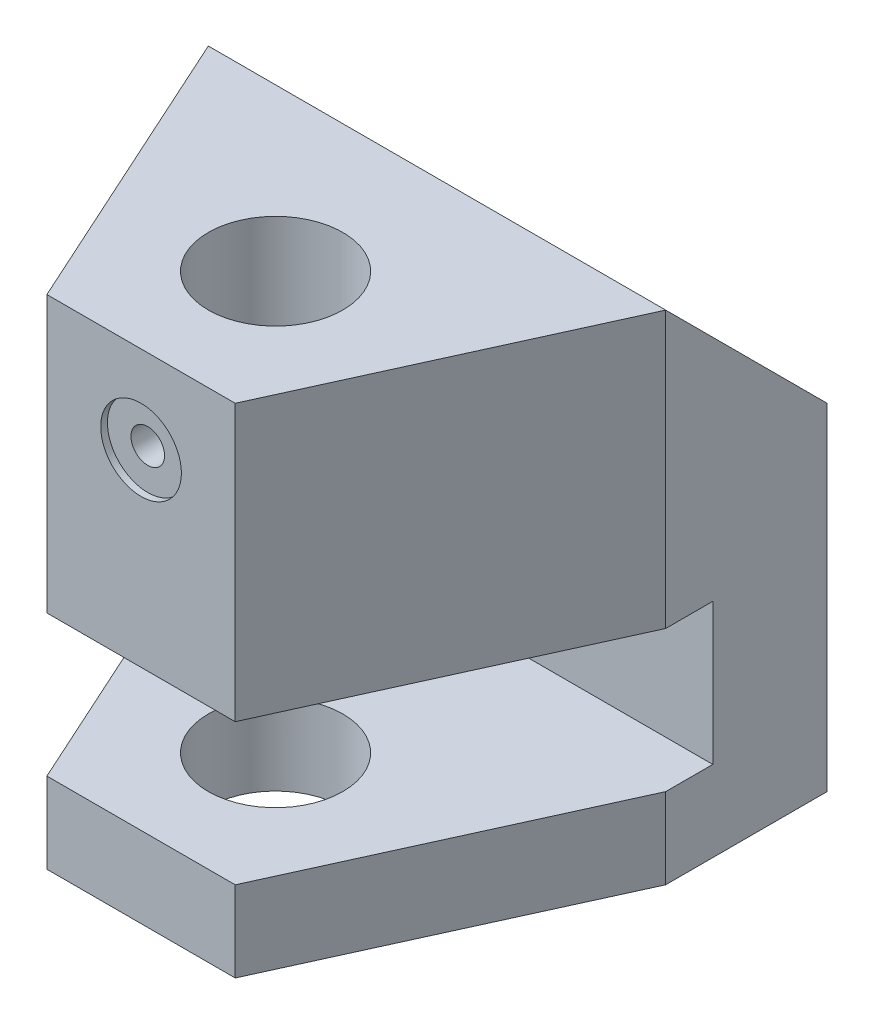
ISO-10303-21;
HEADER;
FILE_DESCRIPTION(('STEP AP214'),'2;1');
FILE_NAME('part.step','',(''),(''),'','','');
FILE_SCHEMA(('AUTOMOTIVE_DESIGN { 1 0 10303 214 1 1 1 1 }'));
ENDSEC;
DATA;
#1=APPLICATION_CONTEXT('core data for automotive mechanical design processes');
#2=APPLICATION_PROTOCOL_DEFINITION('international standard','automotive_design',2000,#1);
#3=PRODUCT_CONTEXT('',#1,'mechanical');
#4=PRODUCT('Part','Part','',(#3));
#5=PRODUCT_RELATED_PRODUCT_CATEGORY('part','',(#4));
#6=PRODUCT_DEFINITION_FORMATION('','',#4);
#7=PRODUCT_DEFINITION_CONTEXT('part definition',#1,'design');
#8=PRODUCT_DEFINITION('design','',#6,#7);
#9=PRODUCT_DEFINITION_SHAPE('','',#8);
#10=(LENGTH_UNIT() NAMED_UNIT(*) SI_UNIT(.MILLI.,.METRE.));
#11=(NAMED_UNIT(*) PLANE_ANGLE_UNIT() SI_UNIT($,.RADIAN.));
#12=(NAMED_UNIT(*) SI_UNIT($,.STERADIAN.) SOLID_ANGLE_UNIT());
#13=UNCERTAINTY_MEASURE_WITH_UNIT(LENGTH_MEASURE(1.E-05),#10,'distance_accuracy_value','');
#14=(GEOMETRIC_REPRESENTATION_CONTEXT(3) GLOBAL_UNCERTAINTY_ASSIGNED_CONTEXT((#13)) GLOBAL_UNIT_ASSIGNED_CONTEXT((#10,
#11,#12)) REPRESENTATION_CONTEXT('',''));
#15=CARTESIAN_POINT('',(0.,0.,0.));
#16=DIRECTION('',(0.,0.,1.));
#17=DIRECTION('',(1.,0.,0.));
#18=AXIS2_PLACEMENT_3D('',#15,#16,#17);
#19=CARTESIAN_POINT('',(0.,0.,34.));
#20=DIRECTION('',(0.,0.,-1.));
#21=DIRECTION('',(-1.,0.,0.));
#22=AXIS2_PLACEMENT_3D('',#19,#20,#21);
#23=PLANE('',#22);
#24=CARTESIAN_POINT('',(34.,61.,34.));
#25=DIRECTION('',(0.,0.,1.));
#26=DIRECTION('',(1.,0.,0.));
#27=AXIS2_PLACEMENT_3D('',#24,#25,#26);
#28=CIRCLE('',#27,6.00000000000001);
#29=CARTESIAN_POINT('',(40.,61.,34.));
#30=VERTEX_POINT('',#29);
#31=EDGE_CURVE('E436',#30,#30,#28,.T.);
#32=ORIENTED_EDGE('',*,*,#31,.F.);
#33=EDGE_LOOP('',(#32));
#34=FACE_BOUND('',#33,.T.);
#35=DIRECTION('',(-1.,0.,0.));
#36=VECTOR('',#35,1.);
#37=CARTESIAN_POINT('',(0.,74.,34.));
#38=LINE('',#37,#36);
#39=CARTESIAN_POINT('',(48.,74.,34.));
#40=VERTEX_POINT('',#39);
#41=CARTESIAN_POINT('',(20.,74.,34.));
#42=VERTEX_POINT('',#41);
#43=EDGE_CURVE('E165',#40,#42,#38,.T.);
#44=ORIENTED_EDGE('',*,*,#43,.T.);
#45=DIRECTION('',(0.,-1.,0.));
#46=VECTOR('',#45,1.);
#47=CARTESIAN_POINT('',(20.,0.,34.));
#48=LINE('',#47,#46);
#49=CARTESIAN_POINT('',(20.,33.,34.));
#50=VERTEX_POINT('',#49);
#51=EDGE_CURVE('E210',#42,#50,#48,.T.);
#52=ORIENTED_EDGE('',*,*,#51,.T.);
#53=DIRECTION('',(1.,0.,0.));
#54=VECTOR('',#53,1.);
#55=CARTESIAN_POINT('',(0.,33.,34.));
#56=LINE('',#55,#54);
#57=CARTESIAN_POINT('',(48.,33.,34.));
#58=VERTEX_POINT('',#57);
#59=EDGE_CURVE('E158',#50,#58,#56,.T.);
#60=ORIENTED_EDGE('',*,*,#59,.T.);
#61=DIRECTION('',(0.,1.,0.));
#62=VECTOR('',#61,1.);
#63=CARTESIAN_POINT('',(48.,0.,34.));
#64=LINE('',#63,#62);
#65=EDGE_CURVE('E191',#58,#40,#64,.T.);
#66=ORIENTED_EDGE('',*,*,#65,.T.);
#67=EDGE_LOOP('',(#44,#52,#60,#66));
#68=FACE_BOUND('',#67,.T.);
#69=ADVANCED_FACE('F33',(#34,#68),#23,.F.);
#70=CARTESIAN_POINT('',(0.,0.,34.));
#71=DIRECTION('',(1.,0.,0.));
#72=DIRECTION('',(0.,0.,-1.));
#73=AXIS2_PLACEMENT_3D('',#70,#71,#72);
#74=PLANE('',#73);
#75=DIRECTION('',(0.,1.,0.));
#76=VECTOR('',#75,1.);
#77=CARTESIAN_POINT('',(0.,0.,-10.0000000000003));
#78=LINE('',#77,#76);
#79=CARTESIAN_POINT('',(0.,33.,-10.0000000000003));
#80=VERTEX_POINT('',#79);
#81=CARTESIAN_POINT('',(0.,74.,-10.0000000000003));
#82=VERTEX_POINT('',#81);
#83=EDGE_CURVE('E205',#80,#82,#78,.T.);
#84=ORIENTED_EDGE('',*,*,#83,.T.);
#85=DIRECTION('',(0.,-0.707106781186549,-0.707106781186546));
#86=VECTOR('',#85,1.);
#87=CARTESIAN_POINT('',(0.,74.,-10.));
#88=LINE('',#87,#86);
#89=CARTESIAN_POINT('',(0.,49.9999999999999,-34.));
#90=VERTEX_POINT('',#89);
#91=EDGE_CURVE('E56',#82,#90,#88,.T.);
#92=ORIENTED_EDGE('',*,*,#91,.T.);
#93=DIRECTION('',(0.,-1.,0.));
#94=VECTOR('',#93,1.);
#95=CARTESIAN_POINT('',(0.,0.,-34.));
#96=LINE('',#95,#94);
#97=CARTESIAN_POINT('',(0.,0.,-34.));
#98=VERTEX_POINT('',#97);
#99=EDGE_CURVE('E160',#90,#98,#96,.T.);
#100=ORIENTED_EDGE('',*,*,#99,.T.);
#101=DIRECTION('',(0.,0.,-1.));
#102=VECTOR('',#101,1.);
#103=CARTESIAN_POINT('',(0.,0.,34.));
#104=LINE('',#103,#102);
#105=CARTESIAN_POINT('',(0.,0.,-10.0000000000003));
#106=VERTEX_POINT('',#105);
#107=EDGE_CURVE('E176',#106,#98,#104,.T.);
#108=ORIENTED_EDGE('',*,*,#107,.F.);
#109=DIRECTION('',(0.,1.,0.));
#110=VECTOR('',#109,1.);
#111=CARTESIAN_POINT('',(0.,0.,-10.0000000000003));
#112=LINE('',#111,#110);
#113=CARTESIAN_POINT('',(0.,12.,-10.0000000000003));
#114=VERTEX_POINT('',#113);
#115=EDGE_CURVE('E129',#106,#114,#112,.T.);
#116=ORIENTED_EDGE('',*,*,#115,.T.);
#117=DIRECTION('',(0.,0.,-1.));
#118=VECTOR('',#117,1.);
#119=CARTESIAN_POINT('',(0.,12.,34.));
#120=LINE('',#119,#118);
#121=CARTESIAN_POINT('',(0.,12.,-17.));
#122=VERTEX_POINT('',#121);
#123=EDGE_CURVE('E121',#114,#122,#120,.T.);
#124=ORIENTED_EDGE('',*,*,#123,.T.);
#125=DIRECTION('',(0.,1.,0.));
#126=VECTOR('',#125,1.);
#127=CARTESIAN_POINT('',(0.,33.,-17.));
#128=LINE('',#127,#126);
#129=CARTESIAN_POINT('',(0.,33.,-17.));
#130=VERTEX_POINT('',#129);
#131=EDGE_CURVE('E126',#122,#130,#128,.T.);
#132=ORIENTED_EDGE('',*,*,#131,.T.);
#133=DIRECTION('',(0.,0.,1.));
#134=VECTOR('',#133,1.);
#135=CARTESIAN_POINT('',(0.,33.,34.));
#136=LINE('',#135,#134);
#137=EDGE_CURVE('E147',#130,#80,#136,.T.);
#138=ORIENTED_EDGE('',*,*,#137,.T.);
#139=EDGE_LOOP('',(#84,#92,#100,#108,#116,#124,#132,#138));
#140=FACE_BOUND('',#139,.T.);
#141=ADVANCED_FACE('F123',(#140),#74,.F.);
#142=CARTESIAN_POINT('',(0.,0.,34.));
#143=DIRECTION('',(0.,1.,0.));
#144=DIRECTION('',(0.,0.,1.));
#145=AXIS2_PLACEMENT_3D('',#142,#143,#144);
#146=PLANE('',#145);
#147=CARTESIAN_POINT('',(34.,0.,14.));
#148=DIRECTION('',(0.,1.,0.));
#149=DIRECTION('',(0.,0.,1.));
#150=AXIS2_PLACEMENT_3D('',#147,#148,#149);
#151=CIRCLE('',#150,9.99999999999999);
#152=CARTESIAN_POINT('',(34.,0.,24.));
#153=VERTEX_POINT('',#152);
#154=EDGE_CURVE('E421',#153,#153,#151,.T.);
#155=ORIENTED_EDGE('',*,*,#154,.T.);
#156=EDGE_LOOP('',(#155));
#157=FACE_BOUND('',#156,.T.);
#158=DIRECTION('',(1.,0.,0.));
#159=VECTOR('',#158,1.);
#160=CARTESIAN_POINT('',(0.,0.,34.));
#161=LINE('',#160,#159);
#162=CARTESIAN_POINT('',(20.,0.,34.));
#163=VERTEX_POINT('',#162);
#164=CARTESIAN_POINT('',(48.,0.,34.));
#165=VERTEX_POINT('',#164);
#166=EDGE_CURVE('E163',#163,#165,#161,.T.);
#167=ORIENTED_EDGE('',*,*,#166,.F.);
#168=DIRECTION('',(0.413802944301182,0.,0.910366477462606));
#169=VECTOR('',#168,1.);
#170=CARTESIAN_POINT('',(20.,0.,34.));
#171=LINE('',#170,#169);
#172=EDGE_CURVE('E203',#163,#106,#171,.F.);
#173=ORIENTED_EDGE('',*,*,#172,.T.);
#174=ORIENTED_EDGE('',*,*,#107,.T.);
#175=DIRECTION('',(1.,0.,0.));
#176=VECTOR('',#175,1.);
#177=CARTESIAN_POINT('',(0.,0.,-34.));
#178=LINE('',#177,#176);
#179=CARTESIAN_POINT('',(68.,0.,-34.));
#180=VERTEX_POINT('',#179);
#181=EDGE_CURVE('E171',#98,#180,#178,.T.);
#182=ORIENTED_EDGE('',*,*,#181,.T.);
#183=DIRECTION('',(0.,0.,-1.));
#184=VECTOR('',#183,1.);
#185=CARTESIAN_POINT('',(68.,0.,34.));
#186=LINE('',#185,#184);
#187=CARTESIAN_POINT('',(68.,0.,-10.0000000000004));
#188=VERTEX_POINT('',#187);
#189=EDGE_CURVE('E169',#188,#180,#186,.T.);
#190=ORIENTED_EDGE('',*,*,#189,.F.);
#191=DIRECTION('',(0.413802944301182,0.,-0.910366477462606));
#192=VECTOR('',#191,1.);
#193=CARTESIAN_POINT('',(48.,0.,34.));
#194=LINE('',#193,#192);
#195=EDGE_CURVE('E188',#188,#165,#194,.F.);
#196=ORIENTED_EDGE('',*,*,#195,.T.);
#197=EDGE_LOOP('',(#167,#173,#174,#182,#190,#196));
#198=FACE_BOUND('',#197,.T.);
#199=ADVANCED_FACE('F261',(#157,#198),#146,.F.);
#200=CARTESIAN_POINT('',(68.,0.,34.));
#201=DIRECTION('',(-1.,0.,0.));
#202=DIRECTION('',(0.,0.,1.));
#203=AXIS2_PLACEMENT_3D('',#200,#201,#202);
#204=PLANE('',#203);
#205=DIRECTION('',(0.,1.,0.));
#206=VECTOR('',#205,1.);
#207=CARTESIAN_POINT('',(68.,0.,-34.));
#208=LINE('',#207,#206);
#209=CARTESIAN_POINT('',(68.,49.9999999999999,-34.));
#210=VERTEX_POINT('',#209);
#211=EDGE_CURVE('E166',#180,#210,#208,.T.);
#212=ORIENTED_EDGE('',*,*,#211,.T.);
#213=DIRECTION('',(0.,0.707106781186549,0.707106781186546));
#214=VECTOR('',#213,1.);
#215=CARTESIAN_POINT('',(68.,74.,-10.));
#216=LINE('',#215,#214);
#217=CARTESIAN_POINT('',(68.,74.,-10.0000000000004));
#218=VERTEX_POINT('',#217);
#219=EDGE_CURVE('E11',#210,#218,#216,.T.);
#220=ORIENTED_EDGE('',*,*,#219,.T.);
#221=DIRECTION('',(0.,-1.,0.));
#222=VECTOR('',#221,1.);
#223=CARTESIAN_POINT('',(68.,0.,-10.0000000000004));
#224=LINE('',#223,#222);
#225=CARTESIAN_POINT('',(68.,33.,-10.0000000000004));
#226=VERTEX_POINT('',#225);
#227=EDGE_CURVE('E184',#218,#226,#224,.T.);
#228=ORIENTED_EDGE('',*,*,#227,.T.);
#229=DIRECTION('',(0.,0.,1.));
#230=VECTOR('',#229,1.);
#231=CARTESIAN_POINT('',(68.,33.,34.));
#232=LINE('',#231,#230);
#233=CARTESIAN_POINT('',(68.,33.,-17.));
#234=VERTEX_POINT('',#233);
#235=EDGE_CURVE('E132',#234,#226,#232,.T.);
#236=ORIENTED_EDGE('',*,*,#235,.F.);
#237=DIRECTION('',(0.,1.,0.));
#238=VECTOR('',#237,1.);
#239=CARTESIAN_POINT('',(68.,33.,-17.));
#240=LINE('',#239,#238);
#241=CARTESIAN_POINT('',(68.,12.,-17.));
#242=VERTEX_POINT('',#241);
#243=EDGE_CURVE('E153',#242,#234,#240,.T.);
#244=ORIENTED_EDGE('',*,*,#243,.F.);
#245=DIRECTION('',(0.,0.,-1.));
#246=VECTOR('',#245,1.);
#247=CARTESIAN_POINT('',(68.,12.,34.));
#248=LINE('',#247,#246);
#249=CARTESIAN_POINT('',(68.,12.,-10.0000000000004));
#250=VERTEX_POINT('',#249);
#251=EDGE_CURVE('E138',#250,#242,#248,.T.);
#252=ORIENTED_EDGE('',*,*,#251,.F.);
#253=DIRECTION('',(0.,-1.,0.));
#254=VECTOR('',#253,1.);
#255=CARTESIAN_POINT('',(68.,0.,-10.0000000000004));
#256=LINE('',#255,#254);
#257=EDGE_CURVE('E186',#250,#188,#256,.T.);
#258=ORIENTED_EDGE('',*,*,#257,.T.);
#259=ORIENTED_EDGE('',*,*,#189,.T.);
#260=EDGE_LOOP('',(#212,#220,#228,#236,#244,#252,#258,#259));
#261=FACE_BOUND('',#260,.T.);
#262=ADVANCED_FACE('F243',(#261),#204,.F.);
#263=CARTESIAN_POINT('',(0.,74.,34.));
#264=DIRECTION('',(0.,-1.,0.));
#265=DIRECTION('',(0.,0.,-1.));
#266=AXIS2_PLACEMENT_3D('',#263,#264,#265);
#267=PLANE('',#266);
#268=CARTESIAN_POINT('',(34.,74.,14.));
#269=DIRECTION('',(0.,1.,0.));
#270=DIRECTION('',(0.,0.,1.));
#271=AXIS2_PLACEMENT_3D('',#268,#269,#270);
#272=CIRCLE('',#271,10.);
#273=CARTESIAN_POINT('',(34.,74.,24.));
#274=VERTEX_POINT('',#273);
#275=EDGE_CURVE('E416',#274,#274,#272,.T.);
#276=ORIENTED_EDGE('',*,*,#275,.F.);
#277=EDGE_LOOP('',(#276));
#278=FACE_BOUND('',#277,.T.);
#279=DIRECTION('',(-0.413802944301182,0.,0.910366477462606));
#280=VECTOR('',#279,1.);
#281=CARTESIAN_POINT('',(48.,74.,34.));
#282=LINE('',#281,#280);
#283=EDGE_CURVE('E194',#40,#218,#282,.F.);
#284=ORIENTED_EDGE('',*,*,#283,.T.);
#285=DIRECTION('',(-1.,0.,0.));
#286=VECTOR('',#285,1.);
#287=CARTESIAN_POINT('',(0.,74.,-10.));
#288=LINE('',#287,#286);
#289=EDGE_CURVE('E217',#218,#82,#288,.T.);
#290=ORIENTED_EDGE('',*,*,#289,.T.);
#291=DIRECTION('',(-0.413802944301182,0.,-0.910366477462606));
#292=VECTOR('',#291,1.);
#293=CARTESIAN_POINT('',(20.,74.,34.));
#294=LINE('',#293,#292);
#295=EDGE_CURVE('E215',#82,#42,#294,.F.);
#296=ORIENTED_EDGE('',*,*,#295,.T.);
#297=ORIENTED_EDGE('',*,*,#43,.F.);
#298=EDGE_LOOP('',(#284,#290,#296,#297));
#299=FACE_BOUND('',#298,.T.);
#300=ADVANCED_FACE('F223',(#278,#299),#267,.F.);
#301=DIRECTION('',(1.,0.,0.));
#302=VECTOR('',#301,1.);
#303=CARTESIAN_POINT('',(0.,12.,34.));
#304=LINE('',#303,#302);
#305=CARTESIAN_POINT('',(20.,12.,34.));
#306=VERTEX_POINT('',#305);
#307=CARTESIAN_POINT('',(48.,12.,34.));
#308=VERTEX_POINT('',#307);
#309=EDGE_CURVE('E143',#306,#308,#304,.T.);
#310=ORIENTED_EDGE('',*,*,#309,.F.);
#311=DIRECTION('',(0.,-1.,0.));
#312=VECTOR('',#311,1.);
#313=CARTESIAN_POINT('',(20.,0.,34.));
#314=LINE('',#313,#312);
#315=EDGE_CURVE('E200',#306,#163,#314,.T.);
#316=ORIENTED_EDGE('',*,*,#315,.T.);
#317=ORIENTED_EDGE('',*,*,#166,.T.);
#318=DIRECTION('',(0.,1.,0.));
#319=VECTOR('',#318,1.);
#320=CARTESIAN_POINT('',(48.,0.,34.));
#321=LINE('',#320,#319);
#322=EDGE_CURVE('E179',#165,#308,#321,.T.);
#323=ORIENTED_EDGE('',*,*,#322,.T.);
#324=EDGE_LOOP('',(#310,#316,#317,#323));
#325=FACE_BOUND('',#324,.T.);
#326=ADVANCED_FACE('F257',(#325),#23,.F.);
#327=CARTESIAN_POINT('',(0.,0.,-34.));
#328=DIRECTION('',(0.,0.,-1.));
#329=DIRECTION('',(-1.,0.,0.));
#330=AXIS2_PLACEMENT_3D('',#327,#328,#329);
#331=PLANE('',#330);
#332=ORIENTED_EDGE('',*,*,#99,.F.);
#333=DIRECTION('',(1.,0.,0.));
#334=VECTOR('',#333,1.);
#335=CARTESIAN_POINT('',(68.,49.9999999999999,-34.));
#336=LINE('',#335,#334);
#337=EDGE_CURVE('E42',#90,#210,#336,.T.);
#338=ORIENTED_EDGE('',*,*,#337,.T.);
#339=ORIENTED_EDGE('',*,*,#211,.F.);
#340=ORIENTED_EDGE('',*,*,#181,.F.);
#341=EDGE_LOOP('',(#332,#338,#339,#340));
#342=FACE_BOUND('',#341,.T.);
#343=ADVANCED_FACE('F267',(#342),#331,.T.);
#344=CARTESIAN_POINT('',(0.,33.,34.));
#345=DIRECTION('',(0.,1.,0.));
#346=DIRECTION('',(0.,0.,1.));
#347=AXIS2_PLACEMENT_3D('',#344,#345,#346);
#348=PLANE('',#347);
#349=CARTESIAN_POINT('',(34.,33.,14.));
#350=DIRECTION('',(0.,1.,0.));
#351=DIRECTION('',(0.,0.,1.));
#352=AXIS2_PLACEMENT_3D('',#349,#350,#351);
#353=CIRCLE('',#352,10.);
#354=CARTESIAN_POINT('',(34.,33.,24.));
#355=VERTEX_POINT('',#354);
#356=EDGE_CURVE('E37',#355,#355,#353,.T.);
#357=ORIENTED_EDGE('',*,*,#356,.T.);
#358=EDGE_LOOP('',(#357));
#359=FACE_BOUND('',#358,.T.);
#360=ORIENTED_EDGE('',*,*,#59,.F.);
#361=DIRECTION('',(0.413802944301182,0.,0.910366477462606));
#362=VECTOR('',#361,1.);
#363=CARTESIAN_POINT('',(20.,33.,34.));
#364=LINE('',#363,#362);
#365=EDGE_CURVE('E213',#50,#80,#364,.F.);
#366=ORIENTED_EDGE('',*,*,#365,.T.);
#367=ORIENTED_EDGE('',*,*,#137,.F.);
#368=DIRECTION('',(1.,0.,0.));
#369=VECTOR('',#368,1.);
#370=CARTESIAN_POINT('',(0.,33.,-17.));
#371=LINE('',#370,#369);
#372=EDGE_CURVE('E142',#130,#234,#371,.T.);
#373=ORIENTED_EDGE('',*,*,#372,.T.);
#374=ORIENTED_EDGE('',*,*,#235,.T.);
#375=DIRECTION('',(0.413802944301182,0.,-0.910366477462606));
#376=VECTOR('',#375,1.);
#377=CARTESIAN_POINT('',(48.,33.,34.));
#378=LINE('',#377,#376);
#379=EDGE_CURVE('E197',#226,#58,#378,.F.);
#380=ORIENTED_EDGE('',*,*,#379,.T.);
#381=EDGE_LOOP('',(#360,#366,#367,#373,#374,#380));
#382=FACE_BOUND('',#381,.T.);
#383=ADVANCED_FACE('F236',(#359,#382),#348,.F.);
#384=CARTESIAN_POINT('',(0.,33.,-17.));
#385=DIRECTION('',(0.,0.,-1.));
#386=DIRECTION('',(0.,1.,0.));
#387=AXIS2_PLACEMENT_3D('',#384,#385,#386);
#388=PLANE('',#387);
#389=ORIENTED_EDGE('',*,*,#243,.T.);
#390=ORIENTED_EDGE('',*,*,#372,.F.);
#391=ORIENTED_EDGE('',*,*,#131,.F.);
#392=DIRECTION('',(1.,0.,0.));
#393=VECTOR('',#392,1.);
#394=CARTESIAN_POINT('',(0.,12.,-17.));
#395=LINE('',#394,#393);
#396=EDGE_CURVE('E135',#122,#242,#395,.T.);
#397=ORIENTED_EDGE('',*,*,#396,.T.);
#398=EDGE_LOOP('',(#389,#390,#391,#397));
#399=FACE_BOUND('',#398,.T.);
#400=ADVANCED_FACE('F145',(#399),#388,.F.);
#401=CARTESIAN_POINT('',(0.,12.,34.));
#402=DIRECTION('',(0.,-1.,0.));
#403=DIRECTION('',(0.,0.,-1.));
#404=AXIS2_PLACEMENT_3D('',#401,#402,#403);
#405=PLANE('',#404);
#406=CARTESIAN_POINT('',(34.,12.,14.));
#407=DIRECTION('',(0.,-1.,0.));
#408=DIRECTION('',(0.,0.,-1.));
#409=AXIS2_PLACEMENT_3D('',#406,#407,#408);
#410=CIRCLE('',#409,10.);
#411=CARTESIAN_POINT('',(34.,12.,4.00000000000001));
#412=VERTEX_POINT('',#411);
#413=EDGE_CURVE('E154',#412,#412,#410,.T.);
#414=ORIENTED_EDGE('',*,*,#413,.T.);
#415=EDGE_LOOP('',(#414));
#416=FACE_BOUND('',#415,.T.);
#417=ORIENTED_EDGE('',*,*,#123,.F.);
#418=DIRECTION('',(-0.413802944301182,0.,-0.910366477462606));
#419=VECTOR('',#418,1.);
#420=CARTESIAN_POINT('',(20.,12.,34.));
#421=LINE('',#420,#419);
#422=EDGE_CURVE('E208',#114,#306,#421,.F.);
#423=ORIENTED_EDGE('',*,*,#422,.T.);
#424=ORIENTED_EDGE('',*,*,#309,.T.);
#425=DIRECTION('',(-0.413802944301182,0.,0.910366477462606));
#426=VECTOR('',#425,1.);
#427=CARTESIAN_POINT('',(48.,12.,34.));
#428=LINE('',#427,#426);
#429=EDGE_CURVE('E182',#308,#250,#428,.F.);
#430=ORIENTED_EDGE('',*,*,#429,.T.);
#431=ORIENTED_EDGE('',*,*,#251,.T.);
#432=ORIENTED_EDGE('',*,*,#396,.F.);
#433=EDGE_LOOP('',(#417,#423,#424,#430,#431,#432));
#434=FACE_BOUND('',#433,.T.);
#435=ADVANCED_FACE('F136',(#416,#434),#405,.F.);
#436=CARTESIAN_POINT('',(48.,0.,34.));
#437=DIRECTION('',(-0.910366477462606,0.,-0.413802944301182));
#438=DIRECTION('',(0.,1.,0.));
#439=AXIS2_PLACEMENT_3D('',#436,#437,#438);
#440=PLANE('',#439);
#441=ORIENTED_EDGE('',*,*,#195,.F.);
#442=ORIENTED_EDGE('',*,*,#257,.F.);
#443=ORIENTED_EDGE('',*,*,#429,.F.);
#444=ORIENTED_EDGE('',*,*,#322,.F.);
#445=EDGE_LOOP('',(#441,#442,#443,#444));
#446=FACE_BOUND('',#445,.T.);
#447=ADVANCED_FACE('F287',(#446),#440,.F.);
#448=CARTESIAN_POINT('',(48.,0.,34.));
#449=DIRECTION('',(-0.910366477462606,0.,-0.413802944301182));
#450=DIRECTION('',(0.,1.,0.));
#451=AXIS2_PLACEMENT_3D('',#448,#449,#450);
#452=PLANE('',#451);
#453=ORIENTED_EDGE('',*,*,#379,.F.);
#454=ORIENTED_EDGE('',*,*,#227,.F.);
#455=ORIENTED_EDGE('',*,*,#283,.F.);
#456=ORIENTED_EDGE('',*,*,#65,.F.);
#457=EDGE_LOOP('',(#453,#454,#455,#456));
#458=FACE_BOUND('',#457,.T.);
#459=ADVANCED_FACE('F241',(#458),#452,.F.);
#460=CARTESIAN_POINT('',(20.,0.,34.));
#461=DIRECTION('',(0.910366477462606,0.,-0.413802944301182));
#462=DIRECTION('',(0.,-1.,0.));
#463=AXIS2_PLACEMENT_3D('',#460,#461,#462);
#464=PLANE('',#463);
#465=ORIENTED_EDGE('',*,*,#422,.F.);
#466=ORIENTED_EDGE('',*,*,#115,.F.);
#467=ORIENTED_EDGE('',*,*,#172,.F.);
#468=ORIENTED_EDGE('',*,*,#315,.F.);
#469=EDGE_LOOP('',(#465,#466,#467,#468));
#470=FACE_BOUND('',#469,.T.);
#471=ADVANCED_FACE('F253',(#470),#464,.F.);
#472=CARTESIAN_POINT('',(20.,0.,34.));
#473=DIRECTION('',(0.910366477462606,0.,-0.413802944301182));
#474=DIRECTION('',(0.,-1.,0.));
#475=AXIS2_PLACEMENT_3D('',#472,#473,#474);
#476=PLANE('',#475);
#477=ORIENTED_EDGE('',*,*,#295,.F.);
#478=ORIENTED_EDGE('',*,*,#83,.F.);
#479=ORIENTED_EDGE('',*,*,#365,.F.);
#480=ORIENTED_EDGE('',*,*,#51,.F.);
#481=EDGE_LOOP('',(#477,#478,#479,#480));
#482=FACE_BOUND('',#481,.T.);
#483=ADVANCED_FACE('F232',(#482),#476,.F.);
#484=CARTESIAN_POINT('',(0.,74.,-10.));
#485=DIRECTION('',(0.,0.707106781186546,-0.707106781186549));
#486=DIRECTION('',(1.,0.,0.));
#487=AXIS2_PLACEMENT_3D('',#484,#485,#486);
#488=PLANE('',#487);
#489=ORIENTED_EDGE('',*,*,#219,.F.);
#490=ORIENTED_EDGE('',*,*,#337,.F.);
#491=ORIENTED_EDGE('',*,*,#91,.F.);
#492=ORIENTED_EDGE('',*,*,#289,.F.);
#493=EDGE_LOOP('',(#489,#490,#491,#492));
#494=FACE_BOUND('',#493,.T.);
#495=ADVANCED_FACE('F35',(#494),#488,.T.);
#496=CARTESIAN_POINT('',(34.,74.,14.));
#497=DIRECTION('',(0.,1.,0.));
#498=DIRECTION('',(0.,0.,1.));
#499=AXIS2_PLACEMENT_3D('',#496,#497,#498);
#500=CYLINDRICAL_SURFACE('',#499,10.);
#501=CARTESIAN_POINT('',(34.,58.5,24.));
#502=CARTESIAN_POINT('',(34.1381268144496,58.5000038762303,23.9999976644669));
#503=CARTESIAN_POINT('',(34.2762969297179,58.5114859179563,23.9971096355304));
#504=CARTESIAN_POINT('',(34.5486772062842,58.557041918845,23.9858685638316));
#505=CARTESIAN_POINT('',(34.6828850781179,58.5911286825631,23.9775124236663));
#506=CARTESIAN_POINT('',(34.9433681203043,58.6807320891035,23.9562604388672));
#507=CARTESIAN_POINT('',(35.0696526057167,58.7362229978588,23.9433700473676));
#508=CARTESIAN_POINT('',(35.3111202198407,58.8669689834081,23.9144223967937));
#509=CARTESIAN_POINT('',(35.4263029739146,58.9422247268649,23.8983650309026));
#510=CARTESIAN_POINT('',(35.6446698788349,59.1120013160903,23.8644568931949));
#511=CARTESIAN_POINT('',(35.7475928167684,59.2068526249318,23.8465784524688));
#512=CARTESIAN_POINT('',(35.9362482120055,59.4124203415151,23.8112270019656));
#513=CARTESIAN_POINT('',(36.0219787282487,59.5231385382449,23.7937540381645));
#514=CARTESIAN_POINT('',(36.1750442379983,59.759325377895,23.7609129283028));
#515=CARTESIAN_POINT('',(36.2420870265419,59.8849887180146,23.7455799077469));
#516=CARTESIAN_POINT('',(36.3539948475846,60.1462473527667,23.7191582469669));
#517=CARTESIAN_POINT('',(36.3988634257336,60.2818410555534,23.7080689282403));
#518=CARTESIAN_POINT('',(36.4642580613413,60.5562391636694,23.6916746116054));
#519=CARTESIAN_POINT('',(36.4852537805534,60.69492482673,23.6862581832835));
#520=CARTESIAN_POINT('',(36.5037696251107,60.9739476149989,23.6814893743265));
#521=CARTESIAN_POINT('',(36.5012935696968,61.1142844678202,23.6821360071321));
#522=CARTESIAN_POINT('',(36.4733108743995,61.3890263462423,23.689320091947));
#523=CARTESIAN_POINT('',(36.4483639003177,61.5234927024422,23.6957143834549));
#524=CARTESIAN_POINT('',(36.377040311505,61.7862684181851,23.7134451611845));
#525=CARTESIAN_POINT('',(36.3306621701156,61.9145773383815,23.7247819994873));
#526=CARTESIAN_POINT('',(36.217315796562,62.1628966937536,23.7512518984277));
#527=CARTESIAN_POINT('',(36.1501444453882,62.282810286316,23.7664221244969));
#528=CARTESIAN_POINT('',(35.9972604600249,62.5098645162614,23.7988285140999));
#529=CARTESIAN_POINT('',(35.911544581348,62.6170029134454,23.8160650389105));
#530=CARTESIAN_POINT('',(35.721105707802,62.818672692824,23.8512646756649));
#531=CARTESIAN_POINT('',(35.6159104302764,62.9127574834356,23.8692344913));
#532=CARTESIAN_POINT('',(35.3910198625061,63.0820354041065,23.9034327596459));
#533=CARTESIAN_POINT('',(35.2713241295132,63.1572279571059,23.9196611591568));
#534=CARTESIAN_POINT('',(35.0201931478023,63.2867509770406,23.9486288682365));
#535=CARTESIAN_POINT('',(34.888718988681,63.3410089004241,23.9613560021288));
#536=CARTESIAN_POINT('',(34.6181266802381,63.4265288428493,23.9817986165236));
#537=CARTESIAN_POINT('',(34.4790099985841,63.4577952606969,23.9895150556547));
#538=CARTESIAN_POINT('',(34.20089995065,63.4957626092647,23.9989249878562));
#539=CARTESIAN_POINT('',(34.0619945333137,63.5030717101255,24.0007675584713));
#540=CARTESIAN_POINT('',(33.7849452086641,63.4945849965742,23.9986467469075));
#541=CARTESIAN_POINT('',(33.6468012339256,63.4787912620014,23.9946838873642));
#542=CARTESIAN_POINT('',(33.3773095520392,63.4250484860144,23.9814930187892));
#543=CARTESIAN_POINT('',(33.2458914683854,63.3874312275384,23.9723439030965));
#544=CARTESIAN_POINT('',(32.9912378459125,63.2914881932859,23.949811777236));
#545=CARTESIAN_POINT('',(32.8680031349456,63.2331603261446,23.9364283394996));
#546=CARTESIAN_POINT('',(32.6307947759503,63.0962731185422,23.9065551321037));
#547=CARTESIAN_POINT('',(32.517024263607,63.0173731460057,23.89001445611));
#548=CARTESIAN_POINT('',(32.3041223105945,62.8420168186714,23.8557418197959));
#549=CARTESIAN_POINT('',(32.2049934017112,62.7455574339706,23.8380096542158));
#550=CARTESIAN_POINT('',(32.0216823865458,62.5349967319272,23.802815949325));
#551=CARTESIAN_POINT('',(31.9379268872981,62.4205204950007,23.7853717363746));
#552=CARTESIAN_POINT('',(31.7908154016439,62.1787789425523,23.7532146397007));
#553=CARTESIAN_POINT('',(31.727458509731,62.0515141950492,23.7385016347494));
#554=CARTESIAN_POINT('',(31.6234142989877,61.7884904626562,23.7136349119466));
#555=CARTESIAN_POINT('',(31.5825926722607,61.6527872861462,23.7034542537581));
#556=CARTESIAN_POINT('',(31.5244239000951,61.3761506035745,23.6887790670659));
#557=CARTESIAN_POINT('',(31.5070716208735,61.2352182482976,23.6842832950404));
#558=CARTESIAN_POINT('',(31.4966023494392,60.9564649602306,23.6815816870161));
#559=CARTESIAN_POINT('',(31.5028035036987,60.8186709414559,23.6831988788803));
#560=CARTESIAN_POINT('',(31.5377045361463,60.5461601855562,23.6921318167214));
#561=CARTESIAN_POINT('',(31.566403962189,60.4114433866447,23.6994474481773));
#562=CARTESIAN_POINT('',(31.645114467595,60.1496525682236,23.7188543447322));
#563=CARTESIAN_POINT('',(31.694997658866,60.0225378245994,23.7309169206106));
#564=CARTESIAN_POINT('',(31.814558477325,59.7783910288107,23.7584625954084));
#565=CARTESIAN_POINT('',(31.884238849943,59.6613603780218,23.7739461686781));
#566=CARTESIAN_POINT('',(32.0435537522714,59.4374089516632,23.8070939043934));
#567=CARTESIAN_POINT('',(32.1336613951462,59.3308315442934,23.824804413863));
#568=CARTESIAN_POINT('',(32.3303510480171,59.1340882586743,23.8601337874377));
#569=CARTESIAN_POINT('',(32.4369369645648,59.043926283145,23.8777526287842));
#570=CARTESIAN_POINT('',(32.6658873554957,58.8809811523923,23.9112942607945));
#571=CARTESIAN_POINT('',(32.7885026294727,58.8085423105474,23.9271805560978));
#572=CARTESIAN_POINT('',(33.0445565674826,58.6854208950991,23.9550820829186));
#573=CARTESIAN_POINT('',(33.1779873942721,58.6347227322524,23.967100086663));
#574=CARTESIAN_POINT('',(33.4259829112609,58.5640469494506,23.9841343260924));
#575=CARTESIAN_POINT('',(33.5393663818199,58.5400812615776,23.9900430842115));
#576=CARTESIAN_POINT('',(33.7684898807729,58.5080567606301,23.9979767538658));
#577=CARTESIAN_POINT('',(33.8842297312623,58.4999967511578,24.0000019575149));
#578=CARTESIAN_POINT('',(34.,58.5,24.));
#579=B_SPLINE_CURVE_WITH_KNOTS('',3,(#501,#502,#503,#504,#505,#506,#507,#508,#509,#510,#511,
#512,#513,#514,#515,#516,#517,#518,#519,#520,#521,#522,#523,#524,#525,#526,#527,#528,#529,#530,
#531,#532,#533,#534,#535,#536,#537,#538,#539,#540,#541,#542,#543,#544,#545,#546,#547,#548,#549,
#550,#551,#552,#553,#554,#555,#556,#557,#558,#559,#560,#561,#562,#563,#564,#565,#566,#567,#568,
#569,#570,#571,#572,#573,#574,#575,#576,#577,#578),.UNSPECIFIED.,.T.,.F.,(4,2,2,2,2,2,2,2,2,2,2,
2,2,2,2,2,2,2,2,2,2,2,2,2,2,2,2,2,2,2,2,2,2,2,2,2,2,2,4),(0.,0.41395618745315,0.828147062939837,
1.24184150381019,1.65554990028222,2.07690725728566,2.49831215966771,2.92597745909679,
3.35357435282282,3.77260491835117,4.19156730193364,4.60037495017232,5.00921172448933,
5.42217546462002,5.83521151399141,6.26002501620568,6.68485149269281,7.11113715020726,
7.53734122819941,7.9526384825433,8.36789835193441,8.77700457528932,9.18615212209354,
9.60255979281123,10.0190393835223,10.44574182013,10.8724253125472,11.2965375769764,
11.7205570543048,12.1323963400749,12.5442273493652,12.9536066760888,13.3630428023797,
13.7831596069298,14.2033761629383,14.6312030917578,15.0587227304538,15.4057040491338,
15.752659267482),.UNSPECIFIED.);
#580=CARTESIAN_POINT('',(34.,58.5,24.));
#581=VERTEX_POINT('',#580);
#582=EDGE_CURVE('E410',#581,#581,#579,.T.);
#583=ORIENTED_EDGE('',*,*,#582,.T.);
#584=EDGE_LOOP('',(#583));
#585=FACE_BOUND('',#584,.T.);
#586=ORIENTED_EDGE('',*,*,#275,.T.);
#587=EDGE_LOOP('',(#586));
#588=FACE_BOUND('',#587,.T.);
#589=ORIENTED_EDGE('',*,*,#356,.F.);
#590=EDGE_LOOP('',(#589));
#591=FACE_BOUND('',#590,.T.);
#592=ADVANCED_FACE('F245',(#585,#588,#591),#500,.F.);
#593=ORIENTED_EDGE('',*,*,#154,.F.);
#594=EDGE_LOOP('',(#593));
#595=FACE_BOUND('',#594,.T.);
#596=ORIENTED_EDGE('',*,*,#413,.F.);
#597=EDGE_LOOP('',(#596));
#598=FACE_BOUND('',#597,.T.);
#599=ADVANCED_FACE('F250',(#595,#598),#500,.F.);
#600=CARTESIAN_POINT('',(34.,61.,34.));
#601=DIRECTION('',(0.,0.,1.));
#602=DIRECTION('',(1.,0.,0.));
#603=AXIS2_PLACEMENT_3D('',#600,#601,#602);
#604=CYLINDRICAL_SURFACE('',#603,2.50000000000001);
#605=ORIENTED_EDGE('',*,*,#582,.F.);
#606=EDGE_LOOP('',(#605));
#607=FACE_BOUND('',#606,.T.);
#608=CARTESIAN_POINT('',(34.,61.,33.));
#609=DIRECTION('',(0.,0.,1.));
#610=DIRECTION('',(1.,0.,0.));
#611=AXIS2_PLACEMENT_3D('',#608,#609,#610);
#612=CIRCLE('',#611,2.50000000000001);
#613=CARTESIAN_POINT('',(36.5,61.,33.));
#614=VERTEX_POINT('',#613);
#615=EDGE_CURVE('E417',#614,#614,#612,.T.);
#616=ORIENTED_EDGE('',*,*,#615,.T.);
#617=EDGE_LOOP('',(#616));
#618=FACE_BOUND('',#617,.T.);
#619=ADVANCED_FACE('F361',(#607,#618),#604,.F.);
#620=CARTESIAN_POINT('',(36.5,61.,33.));
#621=DIRECTION('',(0.,0.,-1.));
#622=DIRECTION('',(-1.,0.,0.));
#623=AXIS2_PLACEMENT_3D('',#620,#621,#622);
#624=PLANE('',#623);
#625=ORIENTED_EDGE('',*,*,#615,.F.);
#626=EDGE_LOOP('',(#625));
#627=FACE_BOUND('',#626,.T.);
#628=CARTESIAN_POINT('',(34.,61.,33.));
#629=DIRECTION('',(0.,0.,1.));
#630=DIRECTION('',(1.,0.,0.));
#631=AXIS2_PLACEMENT_3D('',#628,#629,#630);
#632=CIRCLE('',#631,6.00000000000001);
#633=CARTESIAN_POINT('',(40.,61.,33.));
#634=VERTEX_POINT('',#633);
#635=EDGE_CURVE('E433',#634,#634,#632,.T.);
#636=ORIENTED_EDGE('',*,*,#635,.T.);
#637=EDGE_LOOP('',(#636));
#638=FACE_BOUND('',#637,.T.);
#639=ADVANCED_FACE('F380',(#627,#638),#624,.F.);
#640=CARTESIAN_POINT('',(34.,61.,34.));
#641=DIRECTION('',(0.,0.,1.));
#642=DIRECTION('',(1.,0.,0.));
#643=AXIS2_PLACEMENT_3D('',#640,#641,#642);
#644=CYLINDRICAL_SURFACE('',#643,6.00000000000001);
#645=ORIENTED_EDGE('',*,*,#635,.F.);
#646=EDGE_LOOP('',(#645));
#647=FACE_BOUND('',#646,.T.);
#648=ORIENTED_EDGE('',*,*,#31,.T.);
#649=EDGE_LOOP('',(#648));
#650=FACE_BOUND('',#649,.T.);
#651=ADVANCED_FACE('F390',(#647,#650),#644,.F.);
#652=CLOSED_SHELL('',(#69,#141,#199,#262,#300,#326,#343,#383,#400,#435,#447,#459,#471,#483,#495,
#592,#599,#619,#639,#651));
#653=MANIFOLD_SOLID_BREP('B2',#652);
#654=ADVANCED_BREP_SHAPE_REPRESENTATION('',(#18,#653),#14);
#655=SHAPE_DEFINITION_REPRESENTATION(#9,#654);
ENDSEC;
END-ISO-10303-21;
